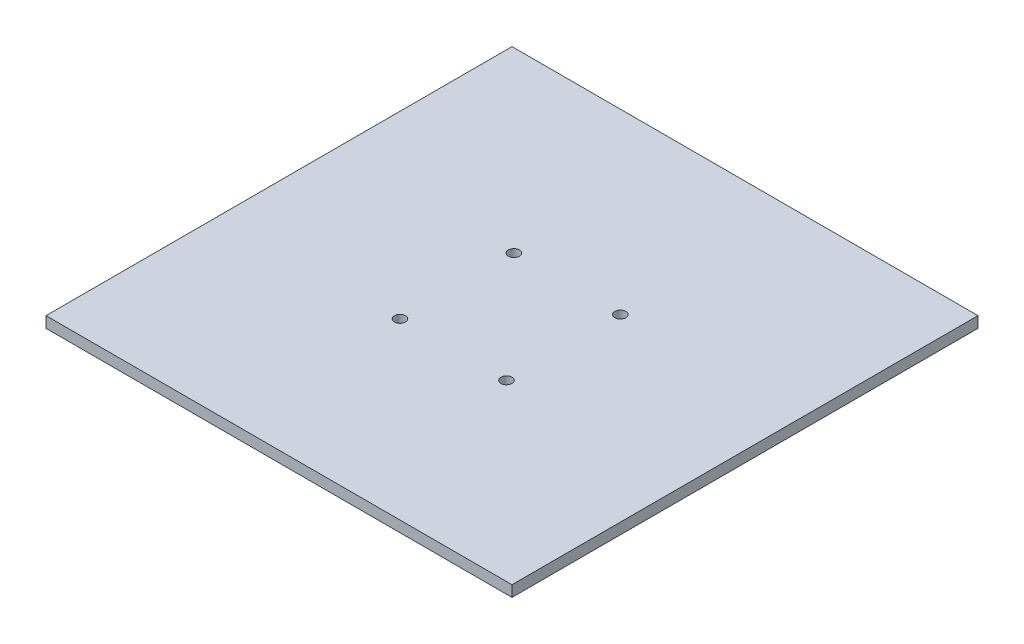
ISO-10303-21;
HEADER;
FILE_DESCRIPTION(('STEP AP214'),'2;1');
FILE_NAME('part.step','',(''),(''),'','','');
FILE_SCHEMA(('AUTOMOTIVE_DESIGN { 1 0 10303 214 1 1 1 1 }'));
ENDSEC;
DATA;
#1=APPLICATION_CONTEXT('core data for automotive mechanical design processes');
#2=APPLICATION_PROTOCOL_DEFINITION('international standard','automotive_design',2000,#1);
#3=PRODUCT_CONTEXT('',#1,'mechanical');
#4=PRODUCT('Part','Part','',(#3));
#5=PRODUCT_RELATED_PRODUCT_CATEGORY('part','',(#4));
#6=PRODUCT_DEFINITION_FORMATION('','',#4);
#7=PRODUCT_DEFINITION_CONTEXT('part definition',#1,'design');
#8=PRODUCT_DEFINITION('design','',#6,#7);
#9=PRODUCT_DEFINITION_SHAPE('','',#8);
#10=(LENGTH_UNIT() NAMED_UNIT(*) SI_UNIT(.MILLI.,.METRE.));
#11=(NAMED_UNIT(*) PLANE_ANGLE_UNIT() SI_UNIT($,.RADIAN.));
#12=(NAMED_UNIT(*) SI_UNIT($,.STERADIAN.) SOLID_ANGLE_UNIT());
#13=UNCERTAINTY_MEASURE_WITH_UNIT(LENGTH_MEASURE(1.E-05),#10,'distance_accuracy_value','');
#14=(GEOMETRIC_REPRESENTATION_CONTEXT(3) GLOBAL_UNCERTAINTY_ASSIGNED_CONTEXT((#13)) GLOBAL_UNIT_ASSIGNED_CONTEXT((#10,
#11,#12)) REPRESENTATION_CONTEXT('',''));
#15=CARTESIAN_POINT('',(0.,0.,0.));
#16=DIRECTION('',(0.,0.,1.));
#17=DIRECTION('',(1.,0.,0.));
#18=AXIS2_PLACEMENT_3D('',#15,#16,#17);
#19=CARTESIAN_POINT('',(0.,3.,0.));
#20=DIRECTION('',(0.,-1.,0.));
#21=DIRECTION('',(0.,0.,-1.));
#22=AXIS2_PLACEMENT_3D('',#19,#20,#21);
#23=PLANE('',#22);
#24=DIRECTION('',(-1.,0.,0.));
#25=VECTOR('',#24,1.);
#26=CARTESIAN_POINT('',(-63.4385341207756,3.,-63.4385341207756));
#27=LINE('',#26,#25);
#28=CARTESIAN_POINT('',(63.4385341207756,3.,-63.4385341207756));
#29=VERTEX_POINT('',#28);
#30=CARTESIAN_POINT('',(-63.4385341207756,3.,-63.4385341207756));
#31=VERTEX_POINT('',#30);
#32=EDGE_CURVE('E84',#29,#31,#27,.T.);
#33=ORIENTED_EDGE('',*,*,#32,.T.);
#34=DIRECTION('',(0.,0.,1.));
#35=VECTOR('',#34,1.);
#36=CARTESIAN_POINT('',(-63.4385341207756,3.,63.4385341207756));
#37=LINE('',#36,#35);
#38=CARTESIAN_POINT('',(-63.4385341207756,3.,63.4385341207756));
#39=VERTEX_POINT('',#38);
#40=EDGE_CURVE('E79',#31,#39,#37,.T.);
#41=ORIENTED_EDGE('',*,*,#40,.T.);
#42=DIRECTION('',(1.,0.,0.));
#43=VECTOR('',#42,1.);
#44=CARTESIAN_POINT('',(63.4385341207756,3.,63.4385341207756));
#45=LINE('',#44,#43);
#46=CARTESIAN_POINT('',(63.4385341207756,3.,63.4385341207756));
#47=VERTEX_POINT('',#46);
#48=EDGE_CURVE('E82',#39,#47,#45,.T.);
#49=ORIENTED_EDGE('',*,*,#48,.T.);
#50=DIRECTION('',(0.,0.,-1.));
#51=VECTOR('',#50,1.);
#52=CARTESIAN_POINT('',(63.4385341207756,3.,-63.4385341207756));
#53=LINE('',#52,#51);
#54=EDGE_CURVE('E49',#47,#29,#53,.T.);
#55=ORIENTED_EDGE('',*,*,#54,.T.);
#56=EDGE_LOOP('',(#33,#41,#49,#55));
#57=FACE_BOUND('',#56,.T.);
#58=CARTESIAN_POINT('',(14.5,3.,-15.));
#59=DIRECTION('',(0.,1.,0.));
#60=DIRECTION('',(0.,0.,1.));
#61=AXIS2_PLACEMENT_3D('',#58,#59,#60);
#62=CIRCLE('',#61,1.5);
#63=CARTESIAN_POINT('',(14.5,3.,-13.5));
#64=VERTEX_POINT('',#63);
#65=EDGE_CURVE('E99',#64,#64,#62,.T.);
#66=ORIENTED_EDGE('',*,*,#65,.F.);
#67=EDGE_LOOP('',(#66));
#68=FACE_BOUND('',#67,.T.);
#69=CARTESIAN_POINT('',(-14.5,3.,-15.));
#70=DIRECTION('',(0.,1.,0.));
#71=DIRECTION('',(0.,0.,1.));
#72=AXIS2_PLACEMENT_3D('',#69,#70,#71);
#73=CIRCLE('',#72,1.5);
#74=CARTESIAN_POINT('',(-14.5,3.,-13.5));
#75=VERTEX_POINT('',#74);
#76=EDGE_CURVE('E114',#75,#75,#73,.T.);
#77=ORIENTED_EDGE('',*,*,#76,.F.);
#78=EDGE_LOOP('',(#77));
#79=FACE_BOUND('',#78,.T.);
#80=CARTESIAN_POINT('',(-14.5,3.,16.));
#81=DIRECTION('',(0.,1.,0.));
#82=DIRECTION('',(0.,0.,1.));
#83=AXIS2_PLACEMENT_3D('',#80,#81,#82);
#84=CIRCLE('',#83,1.5);
#85=CARTESIAN_POINT('',(-14.5,3.,17.5));
#86=VERTEX_POINT('',#85);
#87=EDGE_CURVE('E120',#86,#86,#84,.T.);
#88=ORIENTED_EDGE('',*,*,#87,.F.);
#89=EDGE_LOOP('',(#88));
#90=FACE_BOUND('',#89,.T.);
#91=CARTESIAN_POINT('',(14.5,3.,16.));
#92=DIRECTION('',(0.,1.,0.));
#93=DIRECTION('',(0.,0.,1.));
#94=AXIS2_PLACEMENT_3D('',#91,#92,#93);
#95=CIRCLE('',#94,1.5);
#96=CARTESIAN_POINT('',(14.5,3.,17.5));
#97=VERTEX_POINT('',#96);
#98=EDGE_CURVE('E126',#97,#97,#95,.T.);
#99=ORIENTED_EDGE('',*,*,#98,.F.);
#100=EDGE_LOOP('',(#99));
#101=FACE_BOUND('',#100,.T.);
#102=ADVANCED_FACE('F32',(#57,#68,#79,#90,#101),#23,.F.);
#103=CARTESIAN_POINT('',(0.,0.,0.));
#104=DIRECTION('',(0.,-1.,0.));
#105=DIRECTION('',(0.,0.,-1.));
#106=AXIS2_PLACEMENT_3D('',#103,#104,#105);
#107=PLANE('',#106);
#108=CARTESIAN_POINT('',(-14.5,0.,16.));
#109=DIRECTION('',(0.,1.,0.));
#110=DIRECTION('',(0.,0.,1.));
#111=AXIS2_PLACEMENT_3D('',#108,#109,#110);
#112=CIRCLE('',#111,1.5);
#113=CARTESIAN_POINT('',(-14.5,0.,17.5));
#114=VERTEX_POINT('',#113);
#115=EDGE_CURVE('E123',#114,#114,#112,.T.);
#116=ORIENTED_EDGE('',*,*,#115,.T.);
#117=EDGE_LOOP('',(#116));
#118=FACE_BOUND('',#117,.T.);
#119=CARTESIAN_POINT('',(14.5,0.,-15.));
#120=DIRECTION('',(0.,1.,0.));
#121=DIRECTION('',(0.,0.,1.));
#122=AXIS2_PLACEMENT_3D('',#119,#120,#121);
#123=CIRCLE('',#122,1.5);
#124=CARTESIAN_POINT('',(14.5,0.,-13.5));
#125=VERTEX_POINT('',#124);
#126=EDGE_CURVE('E111',#125,#125,#123,.T.);
#127=ORIENTED_EDGE('',*,*,#126,.T.);
#128=EDGE_LOOP('',(#127));
#129=FACE_BOUND('',#128,.T.);
#130=DIRECTION('',(-1.,0.,0.));
#131=VECTOR('',#130,1.);
#132=CARTESIAN_POINT('',(-63.4385341207756,0.,-63.4385341207756));
#133=LINE('',#132,#131);
#134=CARTESIAN_POINT('',(63.4385341207756,0.,-63.4385341207756));
#135=VERTEX_POINT('',#134);
#136=CARTESIAN_POINT('',(-63.4385341207756,0.,-63.4385341207756));
#137=VERTEX_POINT('',#136);
#138=EDGE_CURVE('E96',#135,#137,#133,.T.);
#139=ORIENTED_EDGE('',*,*,#138,.F.);
#140=DIRECTION('',(0.,0.,-1.));
#141=VECTOR('',#140,1.);
#142=CARTESIAN_POINT('',(63.4385341207756,0.,-63.4385341207756));
#143=LINE('',#142,#141);
#144=CARTESIAN_POINT('',(63.4385341207756,0.,63.4385341207756));
#145=VERTEX_POINT('',#144);
#146=EDGE_CURVE('E72',#145,#135,#143,.T.);
#147=ORIENTED_EDGE('',*,*,#146,.F.);
#148=DIRECTION('',(1.,0.,0.));
#149=VECTOR('',#148,1.);
#150=CARTESIAN_POINT('',(63.4385341207756,0.,63.4385341207756));
#151=LINE('',#150,#149);
#152=CARTESIAN_POINT('',(-63.4385341207756,0.,63.4385341207756));
#153=VERTEX_POINT('',#152);
#154=EDGE_CURVE('E66',#153,#145,#151,.T.);
#155=ORIENTED_EDGE('',*,*,#154,.F.);
#156=DIRECTION('',(0.,0.,1.));
#157=VECTOR('',#156,1.);
#158=CARTESIAN_POINT('',(-63.4385341207756,0.,63.4385341207756));
#159=LINE('',#158,#157);
#160=EDGE_CURVE('E88',#137,#153,#159,.T.);
#161=ORIENTED_EDGE('',*,*,#160,.F.);
#162=EDGE_LOOP('',(#139,#147,#155,#161));
#163=FACE_BOUND('',#162,.T.);
#164=CARTESIAN_POINT('',(-14.5,0.,-15.));
#165=DIRECTION('',(0.,1.,0.));
#166=DIRECTION('',(0.,0.,1.));
#167=AXIS2_PLACEMENT_3D('',#164,#165,#166);
#168=CIRCLE('',#167,1.5);
#169=CARTESIAN_POINT('',(-14.5,0.,-13.5));
#170=VERTEX_POINT('',#169);
#171=EDGE_CURVE('E117',#170,#170,#168,.T.);
#172=ORIENTED_EDGE('',*,*,#171,.T.);
#173=EDGE_LOOP('',(#172));
#174=FACE_BOUND('',#173,.T.);
#175=CARTESIAN_POINT('',(14.5,0.,16.));
#176=DIRECTION('',(0.,1.,0.));
#177=DIRECTION('',(0.,0.,1.));
#178=AXIS2_PLACEMENT_3D('',#175,#176,#177);
#179=CIRCLE('',#178,1.5);
#180=CARTESIAN_POINT('',(14.5,0.,17.5));
#181=VERTEX_POINT('',#180);
#182=EDGE_CURVE('E129',#181,#181,#179,.T.);
#183=ORIENTED_EDGE('',*,*,#182,.T.);
#184=EDGE_LOOP('',(#183));
#185=FACE_BOUND('',#184,.T.);
#186=ADVANCED_FACE('F107',(#118,#129,#163,#174,#185),#107,.T.);
#187=CARTESIAN_POINT('',(-63.4385341207756,3.,-63.4385341207756));
#188=DIRECTION('',(0.,0.,1.));
#189=DIRECTION('',(1.,0.,0.));
#190=AXIS2_PLACEMENT_3D('',#187,#188,#189);
#191=PLANE('',#190);
#192=ORIENTED_EDGE('',*,*,#138,.T.);
#193=DIRECTION('',(0.,-1.,0.));
#194=VECTOR('',#193,1.);
#195=CARTESIAN_POINT('',(-63.4385341207756,3.,-63.4385341207756));
#196=LINE('',#195,#194);
#197=EDGE_CURVE('E11',#31,#137,#196,.T.);
#198=ORIENTED_EDGE('',*,*,#197,.F.);
#199=ORIENTED_EDGE('',*,*,#32,.F.);
#200=DIRECTION('',(0.,-1.,0.));
#201=VECTOR('',#200,1.);
#202=CARTESIAN_POINT('',(63.4385341207756,3.,-63.4385341207756));
#203=LINE('',#202,#201);
#204=EDGE_CURVE('E92',#29,#135,#203,.T.);
#205=ORIENTED_EDGE('',*,*,#204,.T.);
#206=EDGE_LOOP('',(#192,#198,#199,#205));
#207=FACE_BOUND('',#206,.T.);
#208=ADVANCED_FACE('F34',(#207),#191,.F.);
#209=CARTESIAN_POINT('',(-63.4385341207756,3.,63.4385341207756));
#210=DIRECTION('',(1.,0.,0.));
#211=DIRECTION('',(0.,0.,-1.));
#212=AXIS2_PLACEMENT_3D('',#209,#210,#211);
#213=PLANE('',#212);
#214=ORIENTED_EDGE('',*,*,#160,.T.);
#215=DIRECTION('',(0.,-1.,0.));
#216=VECTOR('',#215,1.);
#217=CARTESIAN_POINT('',(-63.4385341207756,3.,63.4385341207756));
#218=LINE('',#217,#216);
#219=EDGE_CURVE('E41',#39,#153,#218,.T.);
#220=ORIENTED_EDGE('',*,*,#219,.F.);
#221=ORIENTED_EDGE('',*,*,#40,.F.);
#222=ORIENTED_EDGE('',*,*,#197,.T.);
#223=EDGE_LOOP('',(#214,#220,#221,#222));
#224=FACE_BOUND('',#223,.T.);
#225=ADVANCED_FACE('F87',(#224),#213,.F.);
#226=CARTESIAN_POINT('',(63.4385341207756,3.,63.4385341207756));
#227=DIRECTION('',(0.,0.,-1.));
#228=DIRECTION('',(-1.,0.,0.));
#229=AXIS2_PLACEMENT_3D('',#226,#227,#228);
#230=PLANE('',#229);
#231=ORIENTED_EDGE('',*,*,#154,.T.);
#232=DIRECTION('',(0.,-1.,0.));
#233=VECTOR('',#232,1.);
#234=CARTESIAN_POINT('',(63.4385341207756,3.,63.4385341207756));
#235=LINE('',#234,#233);
#236=EDGE_CURVE('E89',#47,#145,#235,.T.);
#237=ORIENTED_EDGE('',*,*,#236,.F.);
#238=ORIENTED_EDGE('',*,*,#48,.F.);
#239=ORIENTED_EDGE('',*,*,#219,.T.);
#240=EDGE_LOOP('',(#231,#237,#238,#239));
#241=FACE_BOUND('',#240,.T.);
#242=ADVANCED_FACE('F90',(#241),#230,.F.);
#243=CARTESIAN_POINT('',(63.4385341207756,3.,-63.4385341207756));
#244=DIRECTION('',(-1.,0.,0.));
#245=DIRECTION('',(0.,0.,1.));
#246=AXIS2_PLACEMENT_3D('',#243,#244,#245);
#247=PLANE('',#246);
#248=ORIENTED_EDGE('',*,*,#146,.T.);
#249=ORIENTED_EDGE('',*,*,#204,.F.);
#250=ORIENTED_EDGE('',*,*,#54,.F.);
#251=ORIENTED_EDGE('',*,*,#236,.T.);
#252=EDGE_LOOP('',(#248,#249,#250,#251));
#253=FACE_BOUND('',#252,.T.);
#254=ADVANCED_FACE('F104',(#253),#247,.F.);
#255=CARTESIAN_POINT('',(14.5,3.,-15.));
#256=DIRECTION('',(0.,-1.,0.));
#257=DIRECTION('',(0.,0.,-1.));
#258=AXIS2_PLACEMENT_3D('',#255,#256,#257);
#259=CYLINDRICAL_SURFACE('',#258,1.5);
#260=ORIENTED_EDGE('',*,*,#65,.T.);
#261=EDGE_LOOP('',(#260));
#262=FACE_BOUND('',#261,.T.);
#263=ORIENTED_EDGE('',*,*,#126,.F.);
#264=EDGE_LOOP('',(#263));
#265=FACE_BOUND('',#264,.T.);
#266=ADVANCED_FACE('F146',(#262,#265),#259,.F.);
#267=CARTESIAN_POINT('',(-14.5,3.,-15.));
#268=DIRECTION('',(0.,-1.,0.));
#269=DIRECTION('',(0.,0.,-1.));
#270=AXIS2_PLACEMENT_3D('',#267,#268,#269);
#271=CYLINDRICAL_SURFACE('',#270,1.5);
#272=ORIENTED_EDGE('',*,*,#76,.T.);
#273=EDGE_LOOP('',(#272));
#274=FACE_BOUND('',#273,.T.);
#275=ORIENTED_EDGE('',*,*,#171,.F.);
#276=EDGE_LOOP('',(#275));
#277=FACE_BOUND('',#276,.T.);
#278=ADVANCED_FACE('F192',(#274,#277),#271,.F.);
#279=CARTESIAN_POINT('',(-14.5,3.,16.));
#280=DIRECTION('',(0.,-1.,0.));
#281=DIRECTION('',(0.,0.,-1.));
#282=AXIS2_PLACEMENT_3D('',#279,#280,#281);
#283=CYLINDRICAL_SURFACE('',#282,1.5);
#284=ORIENTED_EDGE('',*,*,#87,.T.);
#285=EDGE_LOOP('',(#284));
#286=FACE_BOUND('',#285,.T.);
#287=ORIENTED_EDGE('',*,*,#115,.F.);
#288=EDGE_LOOP('',(#287));
#289=FACE_BOUND('',#288,.T.);
#290=ADVANCED_FACE('F200',(#286,#289),#283,.F.);
#291=CARTESIAN_POINT('',(14.5,3.,16.));
#292=DIRECTION('',(0.,-1.,0.));
#293=DIRECTION('',(0.,0.,-1.));
#294=AXIS2_PLACEMENT_3D('',#291,#292,#293);
#295=CYLINDRICAL_SURFACE('',#294,1.5);
#296=ORIENTED_EDGE('',*,*,#98,.T.);
#297=EDGE_LOOP('',(#296));
#298=FACE_BOUND('',#297,.T.);
#299=ORIENTED_EDGE('',*,*,#182,.F.);
#300=EDGE_LOOP('',(#299));
#301=FACE_BOUND('',#300,.T.);
#302=ADVANCED_FACE('F135',(#298,#301),#295,.F.);
#303=CLOSED_SHELL('',(#102,#186,#208,#225,#242,#254,#266,#278,#290,#302));
#304=MANIFOLD_SOLID_BREP('B2',#303);
#305=ADVANCED_BREP_SHAPE_REPRESENTATION('',(#18,#304),#14);
#306=SHAPE_DEFINITION_REPRESENTATION(#9,#305);
ENDSEC;
END-ISO-10303-21;
